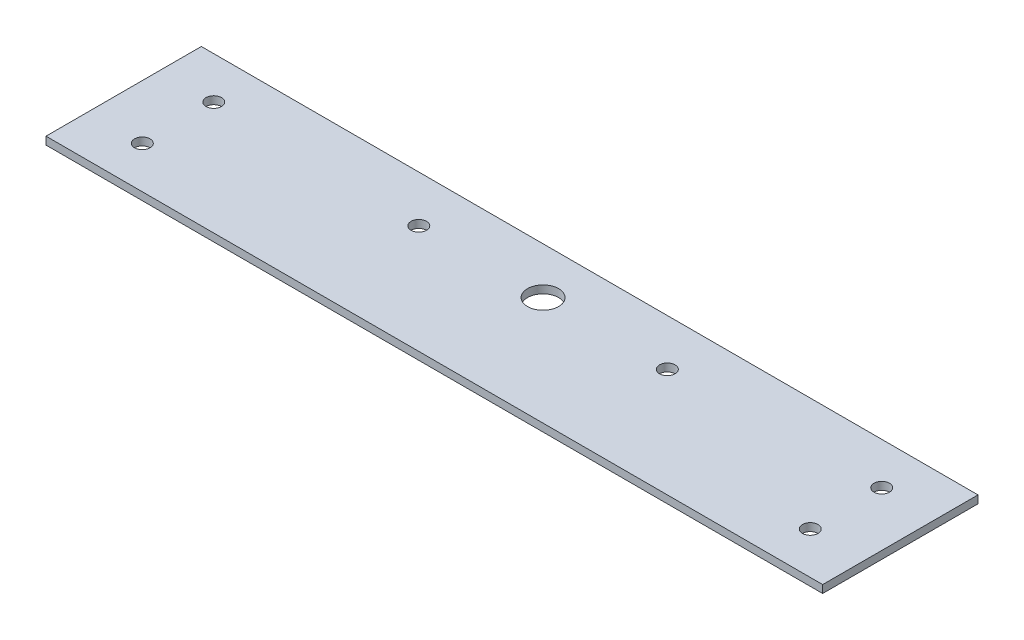
ISO-10303-21;
HEADER;
FILE_DESCRIPTION(('STEP AP214'),'2;1');
FILE_NAME('part.step','',(''),(''),'','','');
FILE_SCHEMA(('AUTOMOTIVE_DESIGN { 1 0 10303 214 1 1 1 1 }'));
ENDSEC;
DATA;
#1=APPLICATION_CONTEXT('core data for automotive mechanical design processes');
#2=APPLICATION_PROTOCOL_DEFINITION('international standard','automotive_design',2000,#1);
#3=PRODUCT_CONTEXT('',#1,'mechanical');
#4=PRODUCT('Part','Part','',(#3));
#5=PRODUCT_RELATED_PRODUCT_CATEGORY('part','',(#4));
#6=PRODUCT_DEFINITION_FORMATION('','',#4);
#7=PRODUCT_DEFINITION_CONTEXT('part definition',#1,'design');
#8=PRODUCT_DEFINITION('design','',#6,#7);
#9=PRODUCT_DEFINITION_SHAPE('','',#8);
#10=(LENGTH_UNIT() NAMED_UNIT(*) SI_UNIT(.MILLI.,.METRE.));
#11=(NAMED_UNIT(*) PLANE_ANGLE_UNIT() SI_UNIT($,.RADIAN.));
#12=(NAMED_UNIT(*) SI_UNIT($,.STERADIAN.) SOLID_ANGLE_UNIT());
#13=UNCERTAINTY_MEASURE_WITH_UNIT(LENGTH_MEASURE(1.E-05),#10,'distance_accuracy_value','');
#14=(GEOMETRIC_REPRESENTATION_CONTEXT(3) GLOBAL_UNCERTAINTY_ASSIGNED_CONTEXT((#13)) GLOBAL_UNIT_ASSIGNED_CONTEXT((#10,
#11,#12)) REPRESENTATION_CONTEXT('',''));
#15=CARTESIAN_POINT('',(0.,0.,0.));
#16=DIRECTION('',(0.,0.,1.));
#17=DIRECTION('',(1.,0.,0.));
#18=AXIS2_PLACEMENT_3D('',#15,#16,#17);
#19=CARTESIAN_POINT('',(0.,5.,0.));
#20=DIRECTION('',(-1.,0.,0.));
#21=DIRECTION('',(0.,0.,1.));
#22=AXIS2_PLACEMENT_3D('',#19,#20,#21);
#23=PLANE('',#22);
#24=DIRECTION('',(0.,0.,-1.));
#25=VECTOR('',#24,1.);
#26=CARTESIAN_POINT('',(0.,0.,0.));
#27=LINE('',#26,#25);
#28=CARTESIAN_POINT('',(0.,0.,0.));
#29=VERTEX_POINT('',#28);
#30=CARTESIAN_POINT('',(0.,0.,-100.));
#31=VERTEX_POINT('',#30);
#32=EDGE_CURVE('E110',#29,#31,#27,.T.);
#33=ORIENTED_EDGE('',*,*,#32,.F.);
#34=DIRECTION('',(0.,-1.,0.));
#35=VECTOR('',#34,1.);
#36=CARTESIAN_POINT('',(0.,5.,0.));
#37=LINE('',#36,#35);
#38=CARTESIAN_POINT('',(0.,5.,0.));
#39=VERTEX_POINT('',#38);
#40=EDGE_CURVE('E11',#39,#29,#37,.T.);
#41=ORIENTED_EDGE('',*,*,#40,.F.);
#42=DIRECTION('',(0.,0.,-1.));
#43=VECTOR('',#42,1.);
#44=CARTESIAN_POINT('',(0.,5.,0.));
#45=LINE('',#44,#43);
#46=CARTESIAN_POINT('',(0.,5.,-100.));
#47=VERTEX_POINT('',#46);
#48=EDGE_CURVE('E102',#39,#47,#45,.T.);
#49=ORIENTED_EDGE('',*,*,#48,.T.);
#50=DIRECTION('',(0.,-1.,0.));
#51=VECTOR('',#50,1.);
#52=CARTESIAN_POINT('',(0.,5.,-100.));
#53=LINE('',#52,#51);
#54=EDGE_CURVE('E41',#47,#31,#53,.T.);
#55=ORIENTED_EDGE('',*,*,#54,.T.);
#56=EDGE_LOOP('',(#33,#41,#49,#55));
#57=FACE_BOUND('',#56,.T.);
#58=ADVANCED_FACE('F38',(#57),#23,.T.);
#59=CARTESIAN_POINT('',(0.,5.,0.));
#60=DIRECTION('',(0.,0.,-1.));
#61=DIRECTION('',(-1.,0.,0.));
#62=AXIS2_PLACEMENT_3D('',#59,#60,#61);
#63=PLANE('',#62);
#64=DIRECTION('',(1.,0.,0.));
#65=VECTOR('',#64,1.);
#66=CARTESIAN_POINT('',(0.,0.,0.));
#67=LINE('',#66,#65);
#68=CARTESIAN_POINT('',(500.,0.,0.));
#69=VERTEX_POINT('',#68);
#70=EDGE_CURVE('E72',#29,#69,#67,.T.);
#71=ORIENTED_EDGE('',*,*,#70,.T.);
#72=DIRECTION('',(0.,-1.,0.));
#73=VECTOR('',#72,1.);
#74=CARTESIAN_POINT('',(500.,5.,0.));
#75=LINE('',#74,#73);
#76=CARTESIAN_POINT('',(500.,5.,0.));
#77=VERTEX_POINT('',#76);
#78=EDGE_CURVE('E48',#77,#69,#75,.T.);
#79=ORIENTED_EDGE('',*,*,#78,.F.);
#80=DIRECTION('',(1.,0.,0.));
#81=VECTOR('',#80,1.);
#82=CARTESIAN_POINT('',(0.,5.,0.));
#83=LINE('',#82,#81);
#84=EDGE_CURVE('E89',#39,#77,#83,.T.);
#85=ORIENTED_EDGE('',*,*,#84,.F.);
#86=ORIENTED_EDGE('',*,*,#40,.T.);
#87=EDGE_LOOP('',(#71,#79,#85,#86));
#88=FACE_BOUND('',#87,.T.);
#89=ADVANCED_FACE('F127',(#88),#63,.F.);
#90=CARTESIAN_POINT('',(500.,5.,0.));
#91=DIRECTION('',(-1.,0.,0.));
#92=DIRECTION('',(0.,0.,1.));
#93=AXIS2_PLACEMENT_3D('',#90,#91,#92);
#94=PLANE('',#93);
#95=DIRECTION('',(0.,0.,-1.));
#96=VECTOR('',#95,1.);
#97=CARTESIAN_POINT('',(500.,0.,0.));
#98=LINE('',#97,#96);
#99=CARTESIAN_POINT('',(500.,0.,-100.));
#100=VERTEX_POINT('',#99);
#101=EDGE_CURVE('E97',#69,#100,#98,.T.);
#102=ORIENTED_EDGE('',*,*,#101,.T.);
#103=DIRECTION('',(0.,-1.,0.));
#104=VECTOR('',#103,1.);
#105=CARTESIAN_POINT('',(500.,5.,-100.));
#106=LINE('',#105,#104);
#107=CARTESIAN_POINT('',(500.,5.,-100.));
#108=VERTEX_POINT('',#107);
#109=EDGE_CURVE('E94',#108,#100,#106,.T.);
#110=ORIENTED_EDGE('',*,*,#109,.F.);
#111=DIRECTION('',(0.,0.,-1.));
#112=VECTOR('',#111,1.);
#113=CARTESIAN_POINT('',(500.,5.,0.));
#114=LINE('',#113,#112);
#115=EDGE_CURVE('E84',#77,#108,#114,.T.);
#116=ORIENTED_EDGE('',*,*,#115,.F.);
#117=ORIENTED_EDGE('',*,*,#78,.T.);
#118=EDGE_LOOP('',(#102,#110,#116,#117));
#119=FACE_BOUND('',#118,.T.);
#120=ADVANCED_FACE('F95',(#119),#94,.F.);
#121=CARTESIAN_POINT('',(0.,5.,-100.));
#122=DIRECTION('',(0.,0.,-1.));
#123=DIRECTION('',(-1.,0.,0.));
#124=AXIS2_PLACEMENT_3D('',#121,#122,#123);
#125=PLANE('',#124);
#126=DIRECTION('',(1.,0.,0.));
#127=VECTOR('',#126,1.);
#128=CARTESIAN_POINT('',(0.,0.,-100.));
#129=LINE('',#128,#127);
#130=EDGE_CURVE('E114',#31,#100,#129,.T.);
#131=ORIENTED_EDGE('',*,*,#130,.F.);
#132=ORIENTED_EDGE('',*,*,#54,.F.);
#133=DIRECTION('',(1.,0.,0.));
#134=VECTOR('',#133,1.);
#135=CARTESIAN_POINT('',(0.,5.,-100.));
#136=LINE('',#135,#134);
#137=EDGE_CURVE('E88',#47,#108,#136,.T.);
#138=ORIENTED_EDGE('',*,*,#137,.T.);
#139=ORIENTED_EDGE('',*,*,#109,.T.);
#140=EDGE_LOOP('',(#131,#132,#138,#139));
#141=FACE_BOUND('',#140,.T.);
#142=ADVANCED_FACE('F100',(#141),#125,.T.);
#143=CARTESIAN_POINT('',(0.,5.,0.));
#144=DIRECTION('',(0.,-1.,0.));
#145=DIRECTION('',(0.,0.,-1.));
#146=AXIS2_PLACEMENT_3D('',#143,#144,#145);
#147=PLANE('',#146);
#148=CARTESIAN_POINT('',(465.,5.,-27.));
#149=DIRECTION('',(0.,-1.,0.));
#150=DIRECTION('',(0.,0.,-1.));
#151=AXIS2_PLACEMENT_3D('',#148,#149,#150);
#152=CIRCLE('',#151,4.99999999999993);
#153=CARTESIAN_POINT('',(465.,5.,-31.9999999999999));
#154=VERTEX_POINT('',#153);
#155=EDGE_CURVE('E193',#154,#154,#152,.T.);
#156=ORIENTED_EDGE('',*,*,#155,.T.);
#157=EDGE_LOOP('',(#156));
#158=FACE_BOUND('',#157,.T.);
#159=CARTESIAN_POINT('',(35.,5.,-73.));
#160=DIRECTION('',(0.,-1.,0.));
#161=DIRECTION('',(0.,0.,-1.));
#162=AXIS2_PLACEMENT_3D('',#159,#160,#161);
#163=CIRCLE('',#162,4.99999999999999);
#164=CARTESIAN_POINT('',(35.,5.,-78.));
#165=VERTEX_POINT('',#164);
#166=EDGE_CURVE('E201',#165,#165,#163,.T.);
#167=ORIENTED_EDGE('',*,*,#166,.T.);
#168=EDGE_LOOP('',(#167));
#169=FACE_BOUND('',#168,.T.);
#170=CARTESIAN_POINT('',(35.,5.,-27.));
#171=DIRECTION('',(0.,-1.,0.));
#172=DIRECTION('',(0.,0.,-1.));
#173=AXIS2_PLACEMENT_3D('',#170,#171,#172);
#174=CIRCLE('',#173,4.99999999999999);
#175=CARTESIAN_POINT('',(35.,5.,-32.));
#176=VERTEX_POINT('',#175);
#177=EDGE_CURVE('E182',#176,#176,#174,.T.);
#178=ORIENTED_EDGE('',*,*,#177,.T.);
#179=EDGE_LOOP('',(#178));
#180=FACE_BOUND('',#179,.T.);
#181=CARTESIAN_POINT('',(465.,5.,-73.));
#182=DIRECTION('',(0.,-1.,0.));
#183=DIRECTION('',(0.,0.,-1.));
#184=AXIS2_PLACEMENT_3D('',#181,#182,#183);
#185=CIRCLE('',#184,4.99999999999994);
#186=CARTESIAN_POINT('',(465.,5.,-77.9999999999999));
#187=VERTEX_POINT('',#186);
#188=EDGE_CURVE('E208',#187,#187,#185,.T.);
#189=ORIENTED_EDGE('',*,*,#188,.T.);
#190=EDGE_LOOP('',(#189));
#191=FACE_BOUND('',#190,.T.);
#192=CARTESIAN_POINT('',(330.,5.,-70.));
#193=DIRECTION('',(0.,1.,0.));
#194=DIRECTION('',(0.,0.,1.));
#195=AXIS2_PLACEMENT_3D('',#192,#193,#194);
#196=CIRCLE('',#195,4.99999999999999);
#197=CARTESIAN_POINT('',(330.,5.,-65.));
#198=VERTEX_POINT('',#197);
#199=EDGE_CURVE('E212',#198,#198,#196,.T.);
#200=ORIENTED_EDGE('',*,*,#199,.F.);
#201=EDGE_LOOP('',(#200));
#202=FACE_BOUND('',#201,.T.);
#203=CARTESIAN_POINT('',(170.,5.,-70.));
#204=DIRECTION('',(0.,1.,0.));
#205=DIRECTION('',(0.,0.,1.));
#206=AXIS2_PLACEMENT_3D('',#203,#204,#205);
#207=CIRCLE('',#206,5.00000000000002);
#208=CARTESIAN_POINT('',(170.,5.,-65.));
#209=VERTEX_POINT('',#208);
#210=EDGE_CURVE('E220',#209,#209,#207,.T.);
#211=ORIENTED_EDGE('',*,*,#210,.F.);
#212=EDGE_LOOP('',(#211));
#213=FACE_BOUND('',#212,.T.);
#214=CARTESIAN_POINT('',(250.,5.,-70.));
#215=DIRECTION('',(0.,1.,0.));
#216=DIRECTION('',(0.,0.,1.));
#217=AXIS2_PLACEMENT_3D('',#214,#215,#216);
#218=CIRCLE('',#217,9.99999999999998);
#219=CARTESIAN_POINT('',(250.,5.,-60.));
#220=VERTEX_POINT('',#219);
#221=EDGE_CURVE('E228',#220,#220,#218,.T.);
#222=ORIENTED_EDGE('',*,*,#221,.F.);
#223=EDGE_LOOP('',(#222));
#224=FACE_BOUND('',#223,.T.);
#225=ORIENTED_EDGE('',*,*,#48,.F.);
#226=ORIENTED_EDGE('',*,*,#84,.T.);
#227=ORIENTED_EDGE('',*,*,#115,.T.);
#228=ORIENTED_EDGE('',*,*,#137,.F.);
#229=EDGE_LOOP('',(#225,#226,#227,#228));
#230=FACE_BOUND('',#229,.T.);
#231=ADVANCED_FACE('F87',(#158,#169,#180,#191,#202,#213,#224,#230),#147,.F.);
#232=CARTESIAN_POINT('',(0.,0.,0.));
#233=DIRECTION('',(0.,-1.,0.));
#234=DIRECTION('',(0.,0.,-1.));
#235=AXIS2_PLACEMENT_3D('',#232,#233,#234);
#236=PLANE('',#235);
#237=CARTESIAN_POINT('',(465.,0.,-27.));
#238=DIRECTION('',(0.,-1.,0.));
#239=DIRECTION('',(0.,0.,-1.));
#240=AXIS2_PLACEMENT_3D('',#237,#238,#239);
#241=CIRCLE('',#240,4.99999999999993);
#242=CARTESIAN_POINT('',(465.,0.,-31.9999999999999));
#243=VERTEX_POINT('',#242);
#244=EDGE_CURVE('E197',#243,#243,#241,.T.);
#245=ORIENTED_EDGE('',*,*,#244,.F.);
#246=EDGE_LOOP('',(#245));
#247=FACE_BOUND('',#246,.T.);
#248=CARTESIAN_POINT('',(35.,0.,-73.));
#249=DIRECTION('',(0.,-1.,0.));
#250=DIRECTION('',(0.,0.,-1.));
#251=AXIS2_PLACEMENT_3D('',#248,#249,#250);
#252=CIRCLE('',#251,4.99999999999999);
#253=CARTESIAN_POINT('',(35.,0.,-78.));
#254=VERTEX_POINT('',#253);
#255=EDGE_CURVE('E190',#254,#254,#252,.T.);
#256=ORIENTED_EDGE('',*,*,#255,.F.);
#257=EDGE_LOOP('',(#256));
#258=FACE_BOUND('',#257,.T.);
#259=CARTESIAN_POINT('',(35.,0.,-27.));
#260=DIRECTION('',(0.,-1.,0.));
#261=DIRECTION('',(0.,0.,-1.));
#262=AXIS2_PLACEMENT_3D('',#259,#260,#261);
#263=CIRCLE('',#262,4.99999999999999);
#264=CARTESIAN_POINT('',(35.,0.,-32.));
#265=VERTEX_POINT('',#264);
#266=EDGE_CURVE('E185',#265,#265,#263,.T.);
#267=ORIENTED_EDGE('',*,*,#266,.F.);
#268=EDGE_LOOP('',(#267));
#269=FACE_BOUND('',#268,.T.);
#270=CARTESIAN_POINT('',(465.,0.,-73.));
#271=DIRECTION('',(0.,-1.,0.));
#272=DIRECTION('',(0.,0.,-1.));
#273=AXIS2_PLACEMENT_3D('',#270,#271,#272);
#274=CIRCLE('',#273,4.99999999999994);
#275=CARTESIAN_POINT('',(465.,0.,-77.9999999999999));
#276=VERTEX_POINT('',#275);
#277=EDGE_CURVE('E196',#276,#276,#274,.T.);
#278=ORIENTED_EDGE('',*,*,#277,.F.);
#279=EDGE_LOOP('',(#278));
#280=FACE_BOUND('',#279,.T.);
#281=CARTESIAN_POINT('',(330.,0.,-70.));
#282=DIRECTION('',(0.,1.,0.));
#283=DIRECTION('',(0.,0.,1.));
#284=AXIS2_PLACEMENT_3D('',#281,#282,#283);
#285=CIRCLE('',#284,4.99999999999999);
#286=CARTESIAN_POINT('',(330.,0.,-65.));
#287=VERTEX_POINT('',#286);
#288=EDGE_CURVE('E216',#287,#287,#285,.T.);
#289=ORIENTED_EDGE('',*,*,#288,.T.);
#290=EDGE_LOOP('',(#289));
#291=FACE_BOUND('',#290,.T.);
#292=CARTESIAN_POINT('',(170.,0.,-70.));
#293=DIRECTION('',(0.,1.,0.));
#294=DIRECTION('',(0.,0.,1.));
#295=AXIS2_PLACEMENT_3D('',#292,#293,#294);
#296=CIRCLE('',#295,5.00000000000002);
#297=CARTESIAN_POINT('',(170.,0.,-65.));
#298=VERTEX_POINT('',#297);
#299=EDGE_CURVE('E224',#298,#298,#296,.T.);
#300=ORIENTED_EDGE('',*,*,#299,.T.);
#301=EDGE_LOOP('',(#300));
#302=FACE_BOUND('',#301,.T.);
#303=CARTESIAN_POINT('',(250.,0.,-70.));
#304=DIRECTION('',(0.,1.,0.));
#305=DIRECTION('',(0.,0.,1.));
#306=AXIS2_PLACEMENT_3D('',#303,#304,#305);
#307=CIRCLE('',#306,9.99999999999998);
#308=CARTESIAN_POINT('',(250.,0.,-60.));
#309=VERTEX_POINT('',#308);
#310=EDGE_CURVE('E115',#309,#309,#307,.T.);
#311=ORIENTED_EDGE('',*,*,#310,.T.);
#312=EDGE_LOOP('',(#311));
#313=FACE_BOUND('',#312,.T.);
#314=ORIENTED_EDGE('',*,*,#32,.T.);
#315=ORIENTED_EDGE('',*,*,#130,.T.);
#316=ORIENTED_EDGE('',*,*,#101,.F.);
#317=ORIENTED_EDGE('',*,*,#70,.F.);
#318=EDGE_LOOP('',(#314,#315,#316,#317));
#319=FACE_BOUND('',#318,.T.);
#320=ADVANCED_FACE('F124',(#247,#258,#269,#280,#291,#302,#313,#319),#236,.T.);
#321=CARTESIAN_POINT('',(250.,0.,-70.));
#322=DIRECTION('',(0.,1.,0.));
#323=DIRECTION('',(0.,0.,1.));
#324=AXIS2_PLACEMENT_3D('',#321,#322,#323);
#325=CYLINDRICAL_SURFACE('',#324,9.99999999999998);
#326=ORIENTED_EDGE('',*,*,#310,.F.);
#327=EDGE_LOOP('',(#326));
#328=FACE_BOUND('',#327,.T.);
#329=ORIENTED_EDGE('',*,*,#221,.T.);
#330=EDGE_LOOP('',(#329));
#331=FACE_BOUND('',#330,.T.);
#332=ADVANCED_FACE('F146',(#328,#331),#325,.F.);
#333=CARTESIAN_POINT('',(170.,0.,-70.));
#334=DIRECTION('',(0.,1.,0.));
#335=DIRECTION('',(0.,0.,1.));
#336=AXIS2_PLACEMENT_3D('',#333,#334,#335);
#337=CYLINDRICAL_SURFACE('',#336,5.00000000000002);
#338=ORIENTED_EDGE('',*,*,#299,.F.);
#339=EDGE_LOOP('',(#338));
#340=FACE_BOUND('',#339,.T.);
#341=ORIENTED_EDGE('',*,*,#210,.T.);
#342=EDGE_LOOP('',(#341));
#343=FACE_BOUND('',#342,.T.);
#344=ADVANCED_FACE('F153',(#340,#343),#337,.F.);
#345=CARTESIAN_POINT('',(330.,0.,-70.));
#346=DIRECTION('',(0.,1.,0.));
#347=DIRECTION('',(0.,0.,1.));
#348=AXIS2_PLACEMENT_3D('',#345,#346,#347);
#349=CYLINDRICAL_SURFACE('',#348,4.99999999999999);
#350=ORIENTED_EDGE('',*,*,#288,.F.);
#351=EDGE_LOOP('',(#350));
#352=FACE_BOUND('',#351,.T.);
#353=ORIENTED_EDGE('',*,*,#199,.T.);
#354=EDGE_LOOP('',(#353));
#355=FACE_BOUND('',#354,.T.);
#356=ADVANCED_FACE('F157',(#352,#355),#349,.F.);
#357=CARTESIAN_POINT('',(465.,5.,-73.));
#358=DIRECTION('',(0.,-1.,0.));
#359=DIRECTION('',(0.,0.,-1.));
#360=AXIS2_PLACEMENT_3D('',#357,#358,#359);
#361=CYLINDRICAL_SURFACE('',#360,4.99999999999994);
#362=ORIENTED_EDGE('',*,*,#188,.F.);
#363=EDGE_LOOP('',(#362));
#364=FACE_BOUND('',#363,.T.);
#365=ORIENTED_EDGE('',*,*,#277,.T.);
#366=EDGE_LOOP('',(#365));
#367=FACE_BOUND('',#366,.T.);
#368=ADVANCED_FACE('F161',(#364,#367),#361,.F.);
#369=CARTESIAN_POINT('',(35.,5.,-27.));
#370=DIRECTION('',(0.,-1.,0.));
#371=DIRECTION('',(0.,0.,-1.));
#372=AXIS2_PLACEMENT_3D('',#369,#370,#371);
#373=CYLINDRICAL_SURFACE('',#372,4.99999999999999);
#374=ORIENTED_EDGE('',*,*,#177,.F.);
#375=EDGE_LOOP('',(#374));
#376=FACE_BOUND('',#375,.T.);
#377=ORIENTED_EDGE('',*,*,#266,.T.);
#378=EDGE_LOOP('',(#377));
#379=FACE_BOUND('',#378,.T.);
#380=ADVANCED_FACE('F165',(#376,#379),#373,.F.);
#381=CARTESIAN_POINT('',(35.,5.,-73.));
#382=DIRECTION('',(0.,-1.,0.));
#383=DIRECTION('',(0.,0.,-1.));
#384=AXIS2_PLACEMENT_3D('',#381,#382,#383);
#385=CYLINDRICAL_SURFACE('',#384,4.99999999999999);
#386=ORIENTED_EDGE('',*,*,#166,.F.);
#387=EDGE_LOOP('',(#386));
#388=FACE_BOUND('',#387,.T.);
#389=ORIENTED_EDGE('',*,*,#255,.T.);
#390=EDGE_LOOP('',(#389));
#391=FACE_BOUND('',#390,.T.);
#392=ADVANCED_FACE('F167',(#388,#391),#385,.F.);
#393=CARTESIAN_POINT('',(465.,5.,-27.));
#394=DIRECTION('',(0.,-1.,0.));
#395=DIRECTION('',(0.,0.,-1.));
#396=AXIS2_PLACEMENT_3D('',#393,#394,#395);
#397=CYLINDRICAL_SURFACE('',#396,4.99999999999993);
#398=ORIENTED_EDGE('',*,*,#155,.F.);
#399=EDGE_LOOP('',(#398));
#400=FACE_BOUND('',#399,.T.);
#401=ORIENTED_EDGE('',*,*,#244,.T.);
#402=EDGE_LOOP('',(#401));
#403=FACE_BOUND('',#402,.T.);
#404=ADVANCED_FACE('F170',(#400,#403),#397,.F.);
#405=CLOSED_SHELL('',(#58,#89,#120,#142,#231,#320,#332,#344,#356,#368,#380,#392,#404));
#406=MANIFOLD_SOLID_BREP('B2',#405);
#407=ADVANCED_BREP_SHAPE_REPRESENTATION('',(#18,#406),#14);
#408=SHAPE_DEFINITION_REPRESENTATION(#9,#407);
ENDSEC;
END-ISO-10303-21;
